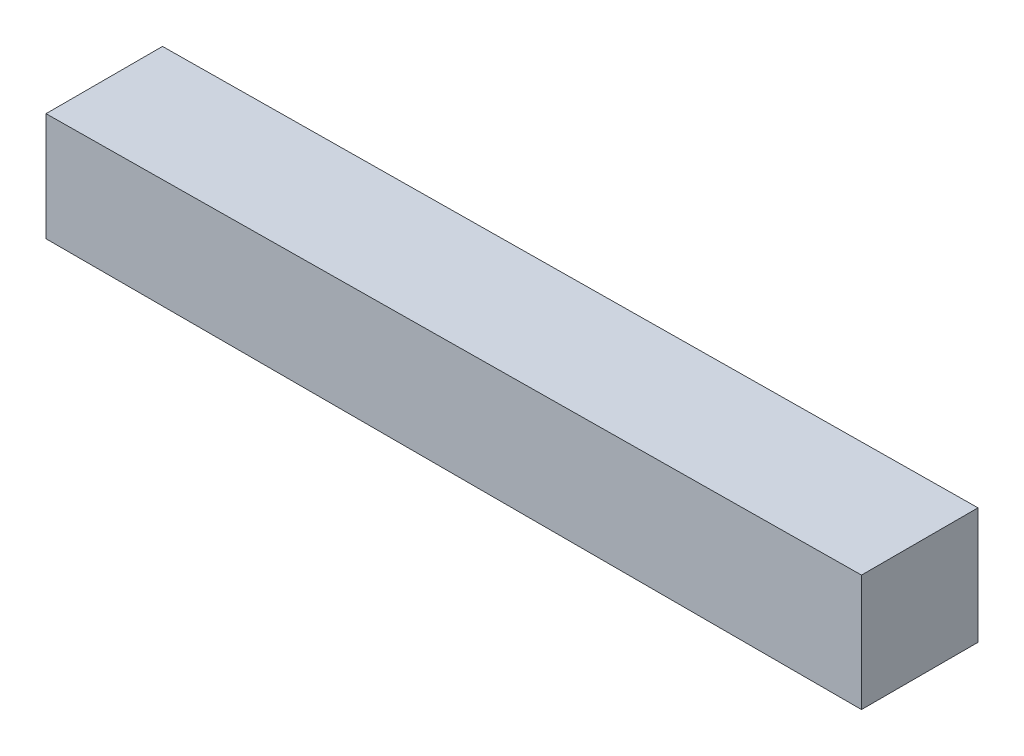
ISO-10303-21;
HEADER;
FILE_DESCRIPTION(('STEP AP214'),'2;1');
FILE_NAME('part.step','',(''),(''),'','','');
FILE_SCHEMA(('AUTOMOTIVE_DESIGN { 1 0 10303 214 1 1 1 1 }'));
ENDSEC;
DATA;
#1=APPLICATION_CONTEXT('core data for automotive mechanical design processes');
#2=APPLICATION_PROTOCOL_DEFINITION('international standard','automotive_design',2000,#1);
#3=PRODUCT_CONTEXT('',#1,'mechanical');
#4=PRODUCT('Part','Part','',(#3));
#5=PRODUCT_RELATED_PRODUCT_CATEGORY('part','',(#4));
#6=PRODUCT_DEFINITION_FORMATION('','',#4);
#7=PRODUCT_DEFINITION_CONTEXT('part definition',#1,'design');
#8=PRODUCT_DEFINITION('design','',#6,#7);
#9=PRODUCT_DEFINITION_SHAPE('','',#8);
#10=(LENGTH_UNIT() NAMED_UNIT(*) SI_UNIT(.MILLI.,.METRE.));
#11=(NAMED_UNIT(*) PLANE_ANGLE_UNIT() SI_UNIT($,.RADIAN.));
#12=(NAMED_UNIT(*) SI_UNIT($,.STERADIAN.) SOLID_ANGLE_UNIT());
#13=UNCERTAINTY_MEASURE_WITH_UNIT(LENGTH_MEASURE(1.E-05),#10,'distance_accuracy_value','');
#14=(GEOMETRIC_REPRESENTATION_CONTEXT(3) GLOBAL_UNCERTAINTY_ASSIGNED_CONTEXT((#13)) GLOBAL_UNIT_ASSIGNED_CONTEXT((#10,
#11,#12)) REPRESENTATION_CONTEXT('',''));
#15=CARTESIAN_POINT('',(0.,0.,0.));
#16=DIRECTION('',(0.,0.,1.));
#17=DIRECTION('',(1.,0.,0.));
#18=AXIS2_PLACEMENT_3D('',#15,#16,#17);
#19=CARTESIAN_POINT('',(-17.5,2.15,2.5));
#20=DIRECTION('',(0.00999950003749696,-0.999950003749688,0.));
#21=DIRECTION('',(0.999950003749688,0.00999950003749696,0.));
#22=AXIS2_PLACEMENT_3D('',#19,#20,#21);
#23=PLANE('',#22);
#24=DIRECTION('',(-0.999950003749688,-0.00999950003749696,0.));
#25=VECTOR('',#24,1.);
#26=CARTESIAN_POINT('',(-17.5,2.15,-2.5));
#27=LINE('',#26,#25);
#28=CARTESIAN_POINT('',(17.5,2.5,-2.5));
#29=VERTEX_POINT('',#28);
#30=CARTESIAN_POINT('',(-17.5,2.15,-2.5));
#31=VERTEX_POINT('',#30);
#32=EDGE_CURVE('E95',#29,#31,#27,.T.);
#33=ORIENTED_EDGE('',*,*,#32,.T.);
#34=DIRECTION('',(0.,0.,-1.));
#35=VECTOR('',#34,1.);
#36=CARTESIAN_POINT('',(-17.5,2.15,2.5));
#37=LINE('',#36,#35);
#38=CARTESIAN_POINT('',(-17.5,2.15,2.5));
#39=VERTEX_POINT('',#38);
#40=EDGE_CURVE('E11',#39,#31,#37,.T.);
#41=ORIENTED_EDGE('',*,*,#40,.F.);
#42=DIRECTION('',(-0.999950003749688,-0.00999950003749696,0.));
#43=VECTOR('',#42,1.);
#44=CARTESIAN_POINT('',(-17.5,2.15,2.5));
#45=LINE('',#44,#43);
#46=CARTESIAN_POINT('',(17.5,2.5,2.5));
#47=VERTEX_POINT('',#46);
#48=EDGE_CURVE('E83',#47,#39,#45,.T.);
#49=ORIENTED_EDGE('',*,*,#48,.F.);
#50=DIRECTION('',(0.,0.,-1.));
#51=VECTOR('',#50,1.);
#52=CARTESIAN_POINT('',(17.5,2.5,2.5));
#53=LINE('',#52,#51);
#54=EDGE_CURVE('E91',#47,#29,#53,.T.);
#55=ORIENTED_EDGE('',*,*,#54,.T.);
#56=EDGE_LOOP('',(#33,#41,#49,#55));
#57=FACE_BOUND('',#56,.T.);
#58=ADVANCED_FACE('F32',(#57),#23,.F.);
#59=CARTESIAN_POINT('',(-17.5,-2.5,2.5));
#60=DIRECTION('',(1.,0.,0.));
#61=DIRECTION('',(0.,0.,-1.));
#62=AXIS2_PLACEMENT_3D('',#59,#60,#61);
#63=PLANE('',#62);
#64=DIRECTION('',(0.,-1.,0.));
#65=VECTOR('',#64,1.);
#66=CARTESIAN_POINT('',(-17.5,-2.5,-2.5));
#67=LINE('',#66,#65);
#68=CARTESIAN_POINT('',(-17.5,-2.5,-2.5));
#69=VERTEX_POINT('',#68);
#70=EDGE_CURVE('E87',#31,#69,#67,.T.);
#71=ORIENTED_EDGE('',*,*,#70,.T.);
#72=DIRECTION('',(0.,0.,-1.));
#73=VECTOR('',#72,1.);
#74=CARTESIAN_POINT('',(-17.5,-2.5,2.5));
#75=LINE('',#74,#73);
#76=CARTESIAN_POINT('',(-17.5,-2.5,2.5));
#77=VERTEX_POINT('',#76);
#78=EDGE_CURVE('E40',#77,#69,#75,.T.);
#79=ORIENTED_EDGE('',*,*,#78,.F.);
#80=DIRECTION('',(0.,-1.,0.));
#81=VECTOR('',#80,1.);
#82=CARTESIAN_POINT('',(-17.5,-2.5,2.5));
#83=LINE('',#82,#81);
#84=EDGE_CURVE('E78',#39,#77,#83,.T.);
#85=ORIENTED_EDGE('',*,*,#84,.F.);
#86=ORIENTED_EDGE('',*,*,#40,.T.);
#87=EDGE_LOOP('',(#71,#79,#85,#86));
#88=FACE_BOUND('',#87,.T.);
#89=ADVANCED_FACE('F86',(#88),#63,.F.);
#90=CARTESIAN_POINT('',(17.5,-2.5,2.5));
#91=DIRECTION('',(0.,1.,0.));
#92=DIRECTION('',(-1.,0.,0.));
#93=AXIS2_PLACEMENT_3D('',#90,#91,#92);
#94=PLANE('',#93);
#95=DIRECTION('',(1.,0.,0.));
#96=VECTOR('',#95,1.);
#97=CARTESIAN_POINT('',(17.5,-2.5,-2.5));
#98=LINE('',#97,#96);
#99=CARTESIAN_POINT('',(17.5,-2.5,-2.5));
#100=VERTEX_POINT('',#99);
#101=EDGE_CURVE('E65',#69,#100,#98,.T.);
#102=ORIENTED_EDGE('',*,*,#101,.T.);
#103=DIRECTION('',(0.,0.,-1.));
#104=VECTOR('',#103,1.);
#105=CARTESIAN_POINT('',(17.5,-2.5,2.5));
#106=LINE('',#105,#104);
#107=CARTESIAN_POINT('',(17.5,-2.5,2.5));
#108=VERTEX_POINT('',#107);
#109=EDGE_CURVE('E88',#108,#100,#106,.T.);
#110=ORIENTED_EDGE('',*,*,#109,.F.);
#111=DIRECTION('',(1.,0.,0.));
#112=VECTOR('',#111,1.);
#113=CARTESIAN_POINT('',(17.5,-2.5,2.5));
#114=LINE('',#113,#112);
#115=EDGE_CURVE('E81',#77,#108,#114,.T.);
#116=ORIENTED_EDGE('',*,*,#115,.F.);
#117=ORIENTED_EDGE('',*,*,#78,.T.);
#118=EDGE_LOOP('',(#102,#110,#116,#117));
#119=FACE_BOUND('',#118,.T.);
#120=ADVANCED_FACE('F89',(#119),#94,.F.);
#121=CARTESIAN_POINT('',(17.5,2.5,2.5));
#122=DIRECTION('',(-1.,0.,0.));
#123=DIRECTION('',(0.,0.,1.));
#124=AXIS2_PLACEMENT_3D('',#121,#122,#123);
#125=PLANE('',#124);
#126=DIRECTION('',(0.,1.,0.));
#127=VECTOR('',#126,1.);
#128=CARTESIAN_POINT('',(17.5,2.5,-2.5));
#129=LINE('',#128,#127);
#130=EDGE_CURVE('E71',#100,#29,#129,.T.);
#131=ORIENTED_EDGE('',*,*,#130,.T.);
#132=ORIENTED_EDGE('',*,*,#54,.F.);
#133=DIRECTION('',(0.,1.,0.));
#134=VECTOR('',#133,1.);
#135=CARTESIAN_POINT('',(17.5,2.5,2.5));
#136=LINE('',#135,#134);
#137=EDGE_CURVE('E48',#108,#47,#136,.T.);
#138=ORIENTED_EDGE('',*,*,#137,.F.);
#139=ORIENTED_EDGE('',*,*,#109,.T.);
#140=EDGE_LOOP('',(#131,#132,#138,#139));
#141=FACE_BOUND('',#140,.T.);
#142=ADVANCED_FACE('F102',(#141),#125,.F.);
#143=CARTESIAN_POINT('',(0.,0.,2.5));
#144=DIRECTION('',(0.,0.,-1.));
#145=DIRECTION('',(-1.,0.,0.));
#146=AXIS2_PLACEMENT_3D('',#143,#144,#145);
#147=PLANE('',#146);
#148=ORIENTED_EDGE('',*,*,#48,.T.);
#149=ORIENTED_EDGE('',*,*,#84,.T.);
#150=ORIENTED_EDGE('',*,*,#115,.T.);
#151=ORIENTED_EDGE('',*,*,#137,.T.);
#152=EDGE_LOOP('',(#148,#149,#150,#151));
#153=FACE_BOUND('',#152,.T.);
#154=ADVANCED_FACE('F79',(#153),#147,.F.);
#155=CARTESIAN_POINT('',(0.,0.,-2.5));
#156=DIRECTION('',(0.,0.,-1.));
#157=DIRECTION('',(-1.,0.,0.));
#158=AXIS2_PLACEMENT_3D('',#155,#156,#157);
#159=PLANE('',#158);
#160=ORIENTED_EDGE('',*,*,#32,.F.);
#161=ORIENTED_EDGE('',*,*,#130,.F.);
#162=ORIENTED_EDGE('',*,*,#101,.F.);
#163=ORIENTED_EDGE('',*,*,#70,.F.);
#164=EDGE_LOOP('',(#160,#161,#162,#163));
#165=FACE_BOUND('',#164,.T.);
#166=ADVANCED_FACE('F105',(#165),#159,.T.);
#167=CLOSED_SHELL('',(#58,#89,#120,#142,#154,#166));
#168=MANIFOLD_SOLID_BREP('B2',#167);
#169=ADVANCED_BREP_SHAPE_REPRESENTATION('',(#18,#168),#14);
#170=SHAPE_DEFINITION_REPRESENTATION(#9,#169);
ENDSEC;
END-ISO-10303-21;
